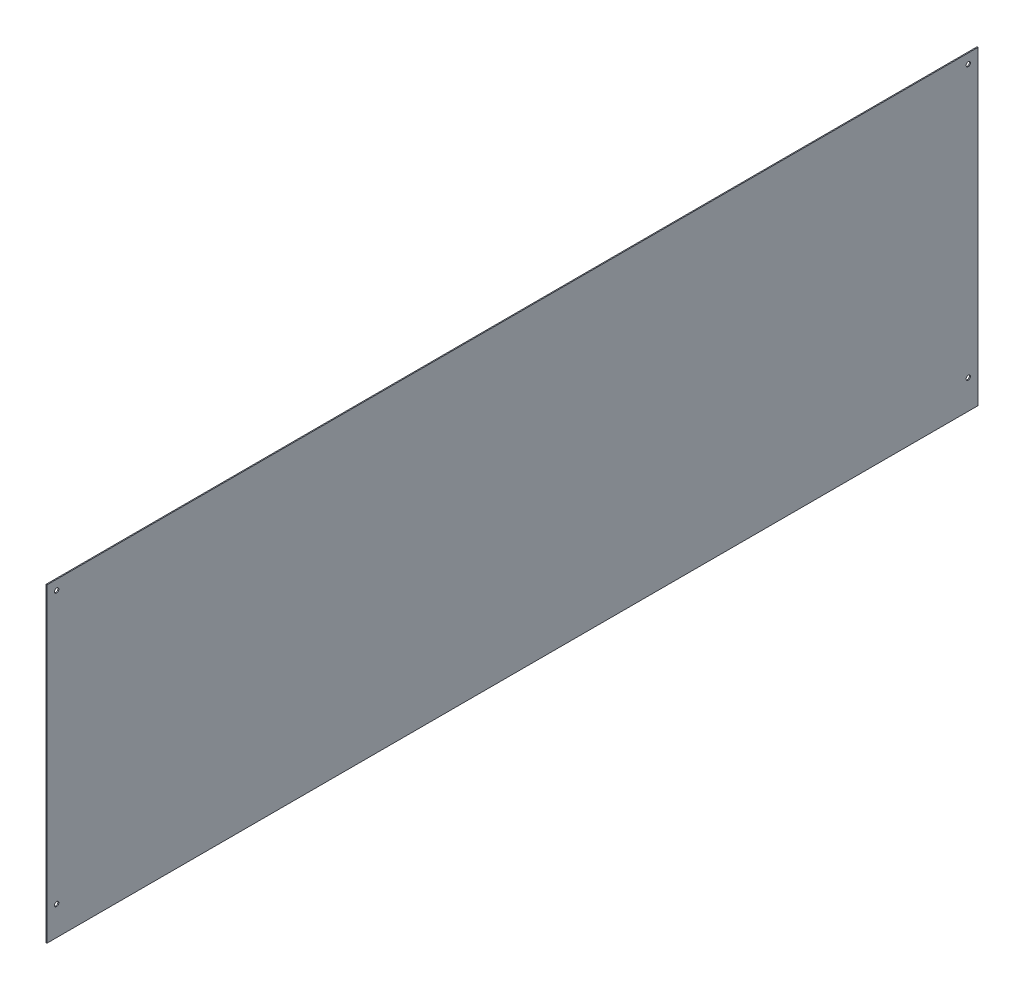
ISO-10303-21;
HEADER;
FILE_DESCRIPTION(('STEP AP214'),'2;1');
FILE_NAME('part.step','',(''),(''),'','','');
FILE_SCHEMA(('AUTOMOTIVE_DESIGN { 1 0 10303 214 1 1 1 1 }'));
ENDSEC;
DATA;
#1=APPLICATION_CONTEXT('core data for automotive mechanical design processes');
#2=APPLICATION_PROTOCOL_DEFINITION('international standard','automotive_design',2000,#1);
#3=PRODUCT_CONTEXT('',#1,'mechanical');
#4=PRODUCT('Part','Part','',(#3));
#5=PRODUCT_RELATED_PRODUCT_CATEGORY('part','',(#4));
#6=PRODUCT_DEFINITION_FORMATION('','',#4);
#7=PRODUCT_DEFINITION_CONTEXT('part definition',#1,'design');
#8=PRODUCT_DEFINITION('design','',#6,#7);
#9=PRODUCT_DEFINITION_SHAPE('','',#8);
#10=(LENGTH_UNIT() NAMED_UNIT(*) SI_UNIT(.MILLI.,.METRE.));
#11=(NAMED_UNIT(*) PLANE_ANGLE_UNIT() SI_UNIT($,.RADIAN.));
#12=(NAMED_UNIT(*) SI_UNIT($,.STERADIAN.) SOLID_ANGLE_UNIT());
#13=UNCERTAINTY_MEASURE_WITH_UNIT(LENGTH_MEASURE(1.E-05),#10,'distance_accuracy_value','');
#14=(GEOMETRIC_REPRESENTATION_CONTEXT(3) GLOBAL_UNCERTAINTY_ASSIGNED_CONTEXT((#13)) GLOBAL_UNIT_ASSIGNED_CONTEXT((#10,
#11,#12)) REPRESENTATION_CONTEXT('',''));
#15=CARTESIAN_POINT('',(0.,0.,0.));
#16=DIRECTION('',(0.,0.,1.));
#17=DIRECTION('',(1.,0.,0.));
#18=AXIS2_PLACEMENT_3D('',#15,#16,#17);
#19=CARTESIAN_POINT('',(0.,-320.,960.));
#20=DIRECTION('',(0.,0.,-1.));
#21=DIRECTION('',(0.,-1.,0.));
#22=AXIS2_PLACEMENT_3D('',#19,#20,#21);
#23=PLANE('',#22);
#24=DIRECTION('',(1.,0.,0.));
#25=VECTOR('',#24,1.);
#26=CARTESIAN_POINT('',(0.,320.,960.));
#27=LINE('',#26,#25);
#28=CARTESIAN_POINT('',(0.,320.,960.));
#29=VERTEX_POINT('',#28);
#30=CARTESIAN_POINT('',(2.,320.,960.));
#31=VERTEX_POINT('',#30);
#32=EDGE_CURVE('E11',#29,#31,#27,.T.);
#33=ORIENTED_EDGE('',*,*,#32,.F.);
#34=DIRECTION('',(0.,-1.,0.));
#35=VECTOR('',#34,1.);
#36=CARTESIAN_POINT('',(0.,-320.,960.));
#37=LINE('',#36,#35);
#38=CARTESIAN_POINT('',(0.,-320.,960.));
#39=VERTEX_POINT('',#38);
#40=EDGE_CURVE('E110',#29,#39,#37,.T.);
#41=ORIENTED_EDGE('',*,*,#40,.T.);
#42=DIRECTION('',(1.,0.,0.));
#43=VECTOR('',#42,1.);
#44=CARTESIAN_POINT('',(0.,-320.,960.));
#45=LINE('',#44,#43);
#46=CARTESIAN_POINT('',(2.,-320.,960.));
#47=VERTEX_POINT('',#46);
#48=EDGE_CURVE('E60',#39,#47,#45,.T.);
#49=ORIENTED_EDGE('',*,*,#48,.T.);
#50=DIRECTION('',(0.,1.,0.));
#51=VECTOR('',#50,1.);
#52=CARTESIAN_POINT('',(2.,0.,960.));
#53=LINE('',#52,#51);
#54=EDGE_CURVE('E124',#31,#47,#53,.F.);
#55=ORIENTED_EDGE('',*,*,#54,.F.);
#56=EDGE_LOOP('',(#33,#41,#49,#55));
#57=FACE_BOUND('',#56,.T.);
#58=ADVANCED_FACE('F49',(#57),#23,.F.);
#59=CARTESIAN_POINT('',(0.,-320.,960.));
#60=DIRECTION('',(0.,1.,0.));
#61=DIRECTION('',(0.,0.,-1.));
#62=AXIS2_PLACEMENT_3D('',#59,#60,#61);
#63=PLANE('',#62);
#64=ORIENTED_EDGE('',*,*,#48,.F.);
#65=DIRECTION('',(0.,0.,-1.));
#66=VECTOR('',#65,1.);
#67=CARTESIAN_POINT('',(0.,-320.,960.));
#68=LINE('',#67,#66);
#69=CARTESIAN_POINT('',(0.,-320.,-960.));
#70=VERTEX_POINT('',#69);
#71=EDGE_CURVE('E101',#39,#70,#68,.T.);
#72=ORIENTED_EDGE('',*,*,#71,.T.);
#73=DIRECTION('',(1.,0.,0.));
#74=VECTOR('',#73,1.);
#75=CARTESIAN_POINT('',(0.,-320.,-960.));
#76=LINE('',#75,#74);
#77=CARTESIAN_POINT('',(2.,-320.,-960.));
#78=VERTEX_POINT('',#77);
#79=EDGE_CURVE('E68',#70,#78,#76,.T.);
#80=ORIENTED_EDGE('',*,*,#79,.T.);
#81=DIRECTION('',(0.,0.,1.));
#82=VECTOR('',#81,1.);
#83=CARTESIAN_POINT('',(2.,-320.,0.));
#84=LINE('',#83,#82);
#85=EDGE_CURVE('E128',#47,#78,#84,.F.);
#86=ORIENTED_EDGE('',*,*,#85,.F.);
#87=EDGE_LOOP('',(#64,#72,#80,#86));
#88=FACE_BOUND('',#87,.T.);
#89=ADVANCED_FACE('F107',(#88),#63,.F.);
#90=CARTESIAN_POINT('',(0.,-320.,-960.));
#91=DIRECTION('',(0.,0.,1.));
#92=DIRECTION('',(0.,1.,0.));
#93=AXIS2_PLACEMENT_3D('',#90,#91,#92);
#94=PLANE('',#93);
#95=ORIENTED_EDGE('',*,*,#79,.F.);
#96=DIRECTION('',(0.,1.,0.));
#97=VECTOR('',#96,1.);
#98=CARTESIAN_POINT('',(0.,-320.,-960.));
#99=LINE('',#98,#97);
#100=CARTESIAN_POINT('',(0.,320.,-960.));
#101=VERTEX_POINT('',#100);
#102=EDGE_CURVE('E90',#70,#101,#99,.T.);
#103=ORIENTED_EDGE('',*,*,#102,.T.);
#104=DIRECTION('',(1.,0.,0.));
#105=VECTOR('',#104,1.);
#106=CARTESIAN_POINT('',(0.,320.,-960.));
#107=LINE('',#106,#105);
#108=CARTESIAN_POINT('',(2.,320.,-960.));
#109=VERTEX_POINT('',#108);
#110=EDGE_CURVE('E53',#101,#109,#107,.T.);
#111=ORIENTED_EDGE('',*,*,#110,.T.);
#112=DIRECTION('',(0.,1.,0.));
#113=VECTOR('',#112,1.);
#114=CARTESIAN_POINT('',(2.,0.,-960.));
#115=LINE('',#114,#113);
#116=EDGE_CURVE('E92',#78,#109,#115,.T.);
#117=ORIENTED_EDGE('',*,*,#116,.F.);
#118=EDGE_LOOP('',(#95,#103,#111,#117));
#119=FACE_BOUND('',#118,.T.);
#120=ADVANCED_FACE('F89',(#119),#94,.F.);
#121=CARTESIAN_POINT('',(0.,300.,940.));
#122=DIRECTION('',(-1.,0.,0.));
#123=DIRECTION('',(0.,0.,1.));
#124=AXIS2_PLACEMENT_3D('',#121,#122,#123);
#125=CYLINDRICAL_SURFACE('',#124,4.49999999999991);
#126=CARTESIAN_POINT('',(2.,300.,940.));
#127=DIRECTION('',(1.,0.,0.));
#128=DIRECTION('',(0.,0.,-1.));
#129=AXIS2_PLACEMENT_3D('',#126,#127,#128);
#130=CIRCLE('',#129,4.49999999999991);
#131=CARTESIAN_POINT('',(2.,300.,935.5));
#132=VERTEX_POINT('',#131);
#133=EDGE_CURVE('E109',#132,#132,#130,.T.);
#134=ORIENTED_EDGE('',*,*,#133,.T.);
#135=EDGE_LOOP('',(#134));
#136=FACE_BOUND('',#135,.T.);
#137=CARTESIAN_POINT('',(0.,300.,940.));
#138=DIRECTION('',(1.,0.,0.));
#139=DIRECTION('',(0.,0.,-1.));
#140=AXIS2_PLACEMENT_3D('',#137,#138,#139);
#141=CIRCLE('',#140,4.49999999999991);
#142=CARTESIAN_POINT('',(0.,300.,935.5));
#143=VERTEX_POINT('',#142);
#144=EDGE_CURVE('E141',#143,#143,#141,.T.);
#145=ORIENTED_EDGE('',*,*,#144,.F.);
#146=EDGE_LOOP('',(#145));
#147=FACE_BOUND('',#146,.T.);
#148=ADVANCED_FACE('F207',(#136,#147),#125,.F.);
#149=CARTESIAN_POINT('',(0.,300.,-940.));
#150=DIRECTION('',(-1.,0.,0.));
#151=DIRECTION('',(0.,0.,1.));
#152=AXIS2_PLACEMENT_3D('',#149,#150,#151);
#153=CYLINDRICAL_SURFACE('',#152,4.49999999999991);
#154=CARTESIAN_POINT('',(2.,300.,-940.));
#155=DIRECTION('',(1.,0.,0.));
#156=DIRECTION('',(0.,0.,-1.));
#157=AXIS2_PLACEMENT_3D('',#154,#155,#156);
#158=CIRCLE('',#157,4.49999999999991);
#159=CARTESIAN_POINT('',(2.,300.,-944.5));
#160=VERTEX_POINT('',#159);
#161=EDGE_CURVE('E115',#160,#160,#158,.T.);
#162=ORIENTED_EDGE('',*,*,#161,.T.);
#163=EDGE_LOOP('',(#162));
#164=FACE_BOUND('',#163,.T.);
#165=CARTESIAN_POINT('',(0.,300.,-940.));
#166=DIRECTION('',(1.,0.,0.));
#167=DIRECTION('',(0.,0.,-1.));
#168=AXIS2_PLACEMENT_3D('',#165,#166,#167);
#169=CIRCLE('',#168,4.49999999999991);
#170=CARTESIAN_POINT('',(0.,300.,-944.5));
#171=VERTEX_POINT('',#170);
#172=EDGE_CURVE('E145',#171,#171,#169,.T.);
#173=ORIENTED_EDGE('',*,*,#172,.F.);
#174=EDGE_LOOP('',(#173));
#175=FACE_BOUND('',#174,.T.);
#176=ADVANCED_FACE('F172',(#164,#175),#153,.F.);
#177=CARTESIAN_POINT('',(0.,-260.,-940.));
#178=DIRECTION('',(-1.,0.,0.));
#179=DIRECTION('',(0.,0.,1.));
#180=AXIS2_PLACEMENT_3D('',#177,#178,#179);
#181=CYLINDRICAL_SURFACE('',#180,4.49999999999991);
#182=CARTESIAN_POINT('',(2.,-260.,-940.));
#183=DIRECTION('',(1.,0.,0.));
#184=DIRECTION('',(0.,0.,-1.));
#185=AXIS2_PLACEMENT_3D('',#182,#183,#184);
#186=CIRCLE('',#185,4.49999999999991);
#187=CARTESIAN_POINT('',(2.,-260.,-944.5));
#188=VERTEX_POINT('',#187);
#189=EDGE_CURVE('E161',#188,#188,#186,.T.);
#190=ORIENTED_EDGE('',*,*,#189,.T.);
#191=EDGE_LOOP('',(#190));
#192=FACE_BOUND('',#191,.T.);
#193=CARTESIAN_POINT('',(0.,-260.,-940.));
#194=DIRECTION('',(1.,0.,0.));
#195=DIRECTION('',(0.,0.,-1.));
#196=AXIS2_PLACEMENT_3D('',#193,#194,#195);
#197=CIRCLE('',#196,4.49999999999991);
#198=CARTESIAN_POINT('',(0.,-260.,-944.5));
#199=VERTEX_POINT('',#198);
#200=EDGE_CURVE('E149',#199,#199,#197,.T.);
#201=ORIENTED_EDGE('',*,*,#200,.F.);
#202=EDGE_LOOP('',(#201));
#203=FACE_BOUND('',#202,.T.);
#204=ADVANCED_FACE('F182',(#192,#203),#181,.F.);
#205=CARTESIAN_POINT('',(0.,-260.,940.));
#206=DIRECTION('',(-1.,0.,0.));
#207=DIRECTION('',(0.,0.,1.));
#208=AXIS2_PLACEMENT_3D('',#205,#206,#207);
#209=CYLINDRICAL_SURFACE('',#208,4.49999999999991);
#210=CARTESIAN_POINT('',(2.,-260.,940.));
#211=DIRECTION('',(1.,0.,0.));
#212=DIRECTION('',(0.,0.,-1.));
#213=AXIS2_PLACEMENT_3D('',#210,#211,#212);
#214=CIRCLE('',#213,4.49999999999991);
#215=CARTESIAN_POINT('',(2.,-260.,935.5));
#216=VERTEX_POINT('',#215);
#217=EDGE_CURVE('E158',#216,#216,#214,.T.);
#218=ORIENTED_EDGE('',*,*,#217,.T.);
#219=EDGE_LOOP('',(#218));
#220=FACE_BOUND('',#219,.T.);
#221=CARTESIAN_POINT('',(0.,-260.,940.));
#222=DIRECTION('',(1.,0.,0.));
#223=DIRECTION('',(0.,0.,-1.));
#224=AXIS2_PLACEMENT_3D('',#221,#222,#223);
#225=CIRCLE('',#224,4.49999999999991);
#226=CARTESIAN_POINT('',(0.,-260.,935.5));
#227=VERTEX_POINT('',#226);
#228=EDGE_CURVE('E105',#227,#227,#225,.T.);
#229=ORIENTED_EDGE('',*,*,#228,.F.);
#230=EDGE_LOOP('',(#229));
#231=FACE_BOUND('',#230,.T.);
#232=ADVANCED_FACE('F185',(#220,#231),#209,.F.);
#233=CARTESIAN_POINT('',(0.,320.,960.));
#234=DIRECTION('',(0.,-1.,0.));
#235=DIRECTION('',(0.,0.,1.));
#236=AXIS2_PLACEMENT_3D('',#233,#234,#235);
#237=PLANE('',#236);
#238=DIRECTION('',(0.,0.,1.));
#239=VECTOR('',#238,1.);
#240=CARTESIAN_POINT('',(0.,320.,960.));
#241=LINE('',#240,#239);
#242=EDGE_CURVE('E103',#101,#29,#241,.T.);
#243=ORIENTED_EDGE('',*,*,#242,.T.);
#244=ORIENTED_EDGE('',*,*,#32,.T.);
#245=DIRECTION('',(0.,0.,1.));
#246=VECTOR('',#245,1.);
#247=CARTESIAN_POINT('',(2.,320.,0.));
#248=LINE('',#247,#246);
#249=EDGE_CURVE('E130',#109,#31,#248,.T.);
#250=ORIENTED_EDGE('',*,*,#249,.F.);
#251=ORIENTED_EDGE('',*,*,#110,.F.);
#252=EDGE_LOOP('',(#243,#244,#250,#251));
#253=FACE_BOUND('',#252,.T.);
#254=ADVANCED_FACE('F51',(#253),#237,.F.);
#255=CARTESIAN_POINT('',(2.,0.,0.));
#256=DIRECTION('',(-1.,0.,0.));
#257=DIRECTION('',(0.,0.,1.));
#258=AXIS2_PLACEMENT_3D('',#255,#256,#257);
#259=PLANE('',#258);
#260=ORIENTED_EDGE('',*,*,#133,.F.);
#261=EDGE_LOOP('',(#260));
#262=FACE_BOUND('',#261,.T.);
#263=ORIENTED_EDGE('',*,*,#161,.F.);
#264=EDGE_LOOP('',(#263));
#265=FACE_BOUND('',#264,.T.);
#266=ORIENTED_EDGE('',*,*,#189,.F.);
#267=EDGE_LOOP('',(#266));
#268=FACE_BOUND('',#267,.T.);
#269=ORIENTED_EDGE('',*,*,#217,.F.);
#270=EDGE_LOOP('',(#269));
#271=FACE_BOUND('',#270,.T.);
#272=ORIENTED_EDGE('',*,*,#116,.T.);
#273=ORIENTED_EDGE('',*,*,#249,.T.);
#274=ORIENTED_EDGE('',*,*,#54,.T.);
#275=ORIENTED_EDGE('',*,*,#85,.T.);
#276=EDGE_LOOP('',(#272,#273,#274,#275));
#277=FACE_BOUND('',#276,.T.);
#278=ADVANCED_FACE('F127',(#262,#265,#268,#271,#277),#259,.F.);
#279=CARTESIAN_POINT('',(0.,0.,0.));
#280=DIRECTION('',(-1.,0.,0.));
#281=DIRECTION('',(0.,0.,1.));
#282=AXIS2_PLACEMENT_3D('',#279,#280,#281);
#283=PLANE('',#282);
#284=ORIENTED_EDGE('',*,*,#144,.T.);
#285=EDGE_LOOP('',(#284));
#286=FACE_BOUND('',#285,.T.);
#287=ORIENTED_EDGE('',*,*,#172,.T.);
#288=EDGE_LOOP('',(#287));
#289=FACE_BOUND('',#288,.T.);
#290=ORIENTED_EDGE('',*,*,#200,.T.);
#291=EDGE_LOOP('',(#290));
#292=FACE_BOUND('',#291,.T.);
#293=ORIENTED_EDGE('',*,*,#228,.T.);
#294=EDGE_LOOP('',(#293));
#295=FACE_BOUND('',#294,.T.);
#296=ORIENTED_EDGE('',*,*,#102,.F.);
#297=ORIENTED_EDGE('',*,*,#71,.F.);
#298=ORIENTED_EDGE('',*,*,#40,.F.);
#299=ORIENTED_EDGE('',*,*,#242,.F.);
#300=EDGE_LOOP('',(#296,#297,#298,#299));
#301=FACE_BOUND('',#300,.T.);
#302=ADVANCED_FACE('F99',(#286,#289,#292,#295,#301),#283,.T.);
#303=CLOSED_SHELL('',(#58,#89,#120,#148,#176,#204,#232,#254,#278,#302));
#304=MANIFOLD_SOLID_BREP('B2',#303);
#305=ADVANCED_BREP_SHAPE_REPRESENTATION('',(#18,#304),#14);
#306=SHAPE_DEFINITION_REPRESENTATION(#9,#305);
ENDSEC;
END-ISO-10303-21;
